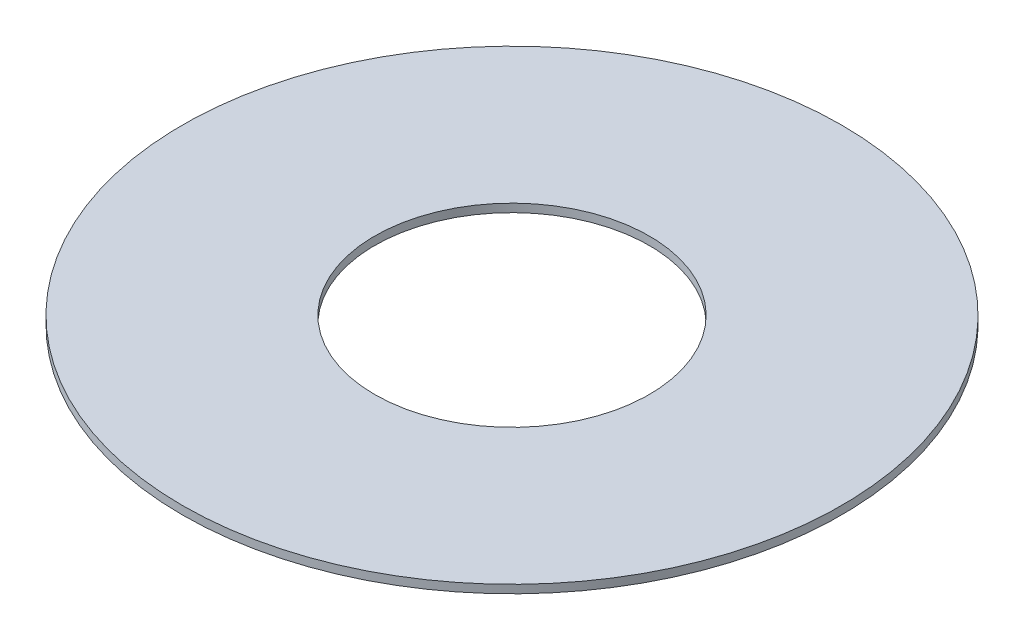
ISO-10303-21;
HEADER;
FILE_DESCRIPTION(('STEP AP214'),'2;1');
FILE_NAME('part.step','',(''),(''),'','','');
FILE_SCHEMA(('AUTOMOTIVE_DESIGN { 1 0 10303 214 1 1 1 1 }'));
ENDSEC;
DATA;
#1=APPLICATION_CONTEXT('core data for automotive mechanical design processes');
#2=APPLICATION_PROTOCOL_DEFINITION('international standard','automotive_design',2000,#1);
#3=PRODUCT_CONTEXT('',#1,'mechanical');
#4=PRODUCT('Part','Part','',(#3));
#5=PRODUCT_RELATED_PRODUCT_CATEGORY('part','',(#4));
#6=PRODUCT_DEFINITION_FORMATION('','',#4);
#7=PRODUCT_DEFINITION_CONTEXT('part definition',#1,'design');
#8=PRODUCT_DEFINITION('design','',#6,#7);
#9=PRODUCT_DEFINITION_SHAPE('','',#8);
#10=(LENGTH_UNIT() NAMED_UNIT(*) SI_UNIT(.MILLI.,.METRE.));
#11=(NAMED_UNIT(*) PLANE_ANGLE_UNIT() SI_UNIT($,.RADIAN.));
#12=(NAMED_UNIT(*) SI_UNIT($,.STERADIAN.) SOLID_ANGLE_UNIT());
#13=UNCERTAINTY_MEASURE_WITH_UNIT(LENGTH_MEASURE(1.E-05),#10,'distance_accuracy_value','');
#14=(GEOMETRIC_REPRESENTATION_CONTEXT(3) GLOBAL_UNCERTAINTY_ASSIGNED_CONTEXT((#13)) GLOBAL_UNIT_ASSIGNED_CONTEXT((#10,
#11,#12)) REPRESENTATION_CONTEXT('',''));
#15=CARTESIAN_POINT('',(0.,0.,0.));
#16=DIRECTION('',(0.,0.,1.));
#17=DIRECTION('',(1.,0.,0.));
#18=AXIS2_PLACEMENT_3D('',#15,#16,#17);
#19=CARTESIAN_POINT('',(0.,1.5,0.));
#20=DIRECTION('',(0.,1.,0.));
#21=DIRECTION('',(0.,0.,1.));
#22=AXIS2_PLACEMENT_3D('',#19,#20,#21);
#23=PLANE('',#22);
#24=CARTESIAN_POINT('',(0.,1.5,0.));
#25=DIRECTION('',(0.,1.,0.));
#26=DIRECTION('',(0.,0.,1.));
#27=AXIS2_PLACEMENT_3D('',#24,#25,#26);
#28=CIRCLE('',#27,120.);
#29=CARTESIAN_POINT('',(0.,1.5,120.));
#30=VERTEX_POINT('',#29);
#31=EDGE_CURVE('E10',#30,#30,#28,.T.);
#32=ORIENTED_EDGE('',*,*,#31,.T.);
#33=EDGE_LOOP('',(#32));
#34=FACE_BOUND('',#33,.T.);
#35=CARTESIAN_POINT('',(0.,1.5,0.));
#36=DIRECTION('',(0.,1.,0.));
#37=DIRECTION('',(0.,0.,1.));
#38=AXIS2_PLACEMENT_3D('',#35,#36,#37);
#39=CIRCLE('',#38,50.);
#40=CARTESIAN_POINT('',(0.,1.5,50.));
#41=VERTEX_POINT('',#40);
#42=EDGE_CURVE('E42',#41,#41,#39,.T.);
#43=ORIENTED_EDGE('',*,*,#42,.F.);
#44=EDGE_LOOP('',(#43));
#45=FACE_BOUND('',#44,.T.);
#46=ADVANCED_FACE('F31',(#34,#45),#23,.T.);
#47=CARTESIAN_POINT('',(0.,-1.5,0.));
#48=DIRECTION('',(0.,1.,0.));
#49=DIRECTION('',(0.,0.,1.));
#50=AXIS2_PLACEMENT_3D('',#47,#48,#49);
#51=PLANE('',#50);
#52=CARTESIAN_POINT('',(0.,-1.5,0.));
#53=DIRECTION('',(0.,1.,0.));
#54=DIRECTION('',(0.,0.,1.));
#55=AXIS2_PLACEMENT_3D('',#52,#53,#54);
#56=CIRCLE('',#55,120.);
#57=CARTESIAN_POINT('',(0.,-1.5,120.));
#58=VERTEX_POINT('',#57);
#59=EDGE_CURVE('E35',#58,#58,#56,.T.);
#60=ORIENTED_EDGE('',*,*,#59,.F.);
#61=EDGE_LOOP('',(#60));
#62=FACE_BOUND('',#61,.T.);
#63=CARTESIAN_POINT('',(0.,-1.5,0.));
#64=DIRECTION('',(0.,1.,0.));
#65=DIRECTION('',(0.,0.,1.));
#66=AXIS2_PLACEMENT_3D('',#63,#64,#65);
#67=CIRCLE('',#66,50.);
#68=CARTESIAN_POINT('',(0.,-1.5,50.));
#69=VERTEX_POINT('',#68);
#70=EDGE_CURVE('E44',#69,#69,#67,.T.);
#71=ORIENTED_EDGE('',*,*,#70,.T.);
#72=EDGE_LOOP('',(#71));
#73=FACE_BOUND('',#72,.T.);
#74=ADVANCED_FACE('F54',(#62,#73),#51,.F.);
#75=CARTESIAN_POINT('',(0.,1.5,0.));
#76=DIRECTION('',(0.,-1.,0.));
#77=DIRECTION('',(0.,0.,-1.));
#78=AXIS2_PLACEMENT_3D('',#75,#76,#77);
#79=CYLINDRICAL_SURFACE('',#78,120.);
#80=ORIENTED_EDGE('',*,*,#31,.F.);
#81=EDGE_LOOP('',(#80));
#82=FACE_BOUND('',#81,.T.);
#83=ORIENTED_EDGE('',*,*,#59,.T.);
#84=EDGE_LOOP('',(#83));
#85=FACE_BOUND('',#84,.T.);
#86=ADVANCED_FACE('F33',(#82,#85),#79,.T.);
#87=CARTESIAN_POINT('',(0.,1.5,0.));
#88=DIRECTION('',(0.,-1.,0.));
#89=DIRECTION('',(0.,0.,-1.));
#90=AXIS2_PLACEMENT_3D('',#87,#88,#89);
#91=CYLINDRICAL_SURFACE('',#90,50.);
#92=ORIENTED_EDGE('',*,*,#42,.T.);
#93=EDGE_LOOP('',(#92));
#94=FACE_BOUND('',#93,.T.);
#95=ORIENTED_EDGE('',*,*,#70,.F.);
#96=EDGE_LOOP('',(#95));
#97=FACE_BOUND('',#96,.T.);
#98=ADVANCED_FACE('F50',(#94,#97),#91,.F.);
#99=CLOSED_SHELL('',(#46,#74,#86,#98));
#100=MANIFOLD_SOLID_BREP('B2',#99);
#101=ADVANCED_BREP_SHAPE_REPRESENTATION('',(#18,#100),#14);
#102=SHAPE_DEFINITION_REPRESENTATION(#9,#101);
ENDSEC;
END-ISO-10303-21;
